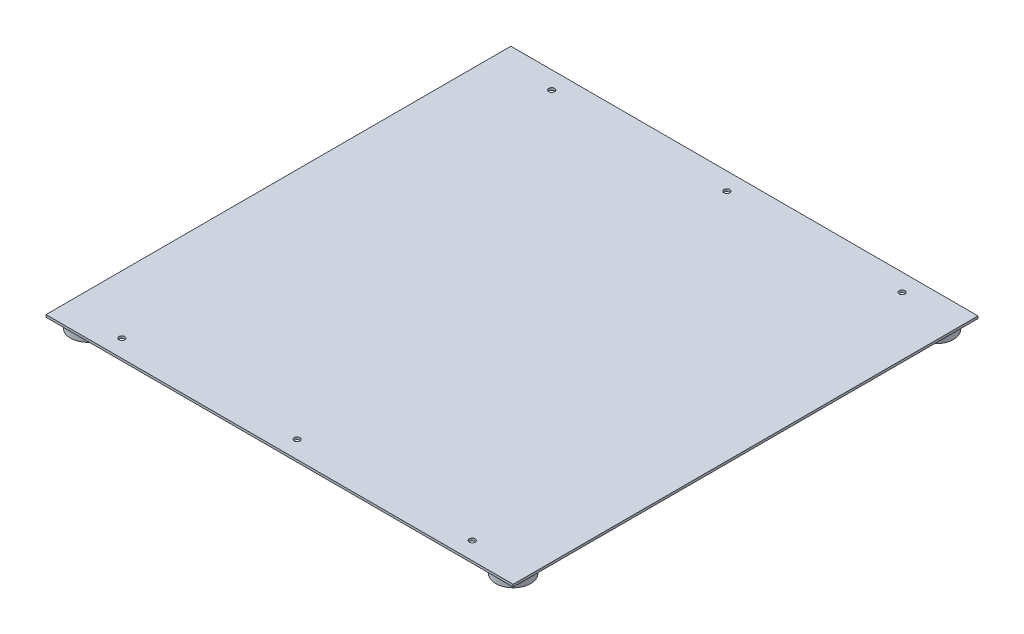
ISO-10303-21;
HEADER;
FILE_DESCRIPTION(('STEP AP214'),'2;1');
FILE_NAME('part.step','',(''),(''),'','','');
FILE_SCHEMA(('AUTOMOTIVE_DESIGN { 1 0 10303 214 1 1 1 1 }'));
ENDSEC;
DATA;
#1=APPLICATION_CONTEXT('core data for automotive mechanical design processes');
#2=APPLICATION_PROTOCOL_DEFINITION('international standard','automotive_design',2000,#1);
#3=PRODUCT_CONTEXT('',#1,'mechanical');
#4=PRODUCT('Part','Part','',(#3));
#5=PRODUCT_RELATED_PRODUCT_CATEGORY('part','',(#4));
#6=PRODUCT_DEFINITION_FORMATION('','',#4);
#7=PRODUCT_DEFINITION_CONTEXT('part definition',#1,'design');
#8=PRODUCT_DEFINITION('design','',#6,#7);
#9=PRODUCT_DEFINITION_SHAPE('','',#8);
#10=(LENGTH_UNIT() NAMED_UNIT(*) SI_UNIT(.MILLI.,.METRE.));
#11=(NAMED_UNIT(*) PLANE_ANGLE_UNIT() SI_UNIT($,.RADIAN.));
#12=(NAMED_UNIT(*) SI_UNIT($,.STERADIAN.) SOLID_ANGLE_UNIT());
#13=UNCERTAINTY_MEASURE_WITH_UNIT(LENGTH_MEASURE(1.E-05),#10,'distance_accuracy_value','');
#14=(GEOMETRIC_REPRESENTATION_CONTEXT(3) GLOBAL_UNCERTAINTY_ASSIGNED_CONTEXT((#13)) GLOBAL_UNIT_ASSIGNED_CONTEXT((#10,
#11,#12)) REPRESENTATION_CONTEXT('',''));
#15=CARTESIAN_POINT('',(0.,0.,0.));
#16=DIRECTION('',(0.,0.,1.));
#17=DIRECTION('',(1.,0.,0.));
#18=AXIS2_PLACEMENT_3D('',#15,#16,#17);
#19=CARTESIAN_POINT('',(0.,2.,0.));
#20=DIRECTION('',(0.,-1.,0.));
#21=DIRECTION('',(0.,0.,-1.));
#22=AXIS2_PLACEMENT_3D('',#19,#20,#21);
#23=PLANE('',#22);
#24=DIRECTION('',(0.,0.,1.));
#25=VECTOR('',#24,1.);
#26=CARTESIAN_POINT('',(0.,2.,0.));
#27=LINE('',#26,#25);
#28=CARTESIAN_POINT('',(0.,2.,-398.));
#29=VERTEX_POINT('',#28);
#30=CARTESIAN_POINT('',(0.,2.,0.));
#31=VERTEX_POINT('',#30);
#32=EDGE_CURVE('E88',#29,#31,#27,.T.);
#33=ORIENTED_EDGE('',*,*,#32,.T.);
#34=DIRECTION('',(1.,0.,0.));
#35=VECTOR('',#34,1.);
#36=CARTESIAN_POINT('',(0.,2.,0.));
#37=LINE('',#36,#35);
#38=CARTESIAN_POINT('',(400.,2.,0.));
#39=VERTEX_POINT('',#38);
#40=EDGE_CURVE('E83',#31,#39,#37,.T.);
#41=ORIENTED_EDGE('',*,*,#40,.T.);
#42=DIRECTION('',(0.,0.,-1.));
#43=VECTOR('',#42,1.);
#44=CARTESIAN_POINT('',(400.,2.,0.));
#45=LINE('',#44,#43);
#46=CARTESIAN_POINT('',(400.,2.,-398.));
#47=VERTEX_POINT('',#46);
#48=EDGE_CURVE('E86',#39,#47,#45,.T.);
#49=ORIENTED_EDGE('',*,*,#48,.T.);
#50=DIRECTION('',(-1.,0.,0.));
#51=VECTOR('',#50,1.);
#52=CARTESIAN_POINT('',(0.,2.,-398.));
#53=LINE('',#52,#51);
#54=EDGE_CURVE('E53',#47,#29,#53,.T.);
#55=ORIENTED_EDGE('',*,*,#54,.T.);
#56=EDGE_LOOP('',(#33,#41,#49,#55));
#57=FACE_BOUND('',#56,.T.);
#58=CARTESIAN_POINT('',(50.,2.,-15.));
#59=DIRECTION('',(0.,1.,0.));
#60=DIRECTION('',(0.,0.,1.));
#61=AXIS2_PLACEMENT_3D('',#58,#59,#60);
#62=CIRCLE('',#61,2.5);
#63=CARTESIAN_POINT('',(50.,2.,-12.5));
#64=VERTEX_POINT('',#63);
#65=EDGE_CURVE('E103',#64,#64,#62,.T.);
#66=ORIENTED_EDGE('',*,*,#65,.F.);
#67=EDGE_LOOP('',(#66));
#68=FACE_BOUND('',#67,.T.);
#69=CARTESIAN_POINT('',(200.,2.,-15.));
#70=DIRECTION('',(0.,1.,0.));
#71=DIRECTION('',(0.,0.,1.));
#72=AXIS2_PLACEMENT_3D('',#69,#70,#71);
#73=CIRCLE('',#72,2.5);
#74=CARTESIAN_POINT('',(200.,2.,-12.5));
#75=VERTEX_POINT('',#74);
#76=EDGE_CURVE('E118',#75,#75,#73,.T.);
#77=ORIENTED_EDGE('',*,*,#76,.F.);
#78=EDGE_LOOP('',(#77));
#79=FACE_BOUND('',#78,.T.);
#80=CARTESIAN_POINT('',(350.,2.,-15.));
#81=DIRECTION('',(0.,1.,0.));
#82=DIRECTION('',(0.,0.,1.));
#83=AXIS2_PLACEMENT_3D('',#80,#81,#82);
#84=CIRCLE('',#83,2.50000000000002);
#85=CARTESIAN_POINT('',(350.,2.,-12.5));
#86=VERTEX_POINT('',#85);
#87=EDGE_CURVE('E124',#86,#86,#84,.T.);
#88=ORIENTED_EDGE('',*,*,#87,.F.);
#89=EDGE_LOOP('',(#88));
#90=FACE_BOUND('',#89,.T.);
#91=CARTESIAN_POINT('',(350.,2.,-383.));
#92=DIRECTION('',(0.,1.,0.));
#93=DIRECTION('',(0.,0.,-1.));
#94=AXIS2_PLACEMENT_3D('',#91,#92,#93);
#95=CIRCLE('',#94,2.50000000000002);
#96=CARTESIAN_POINT('',(350.,2.,-385.5));
#97=VERTEX_POINT('',#96);
#98=EDGE_CURVE('E130',#97,#97,#95,.T.);
#99=ORIENTED_EDGE('',*,*,#98,.F.);
#100=EDGE_LOOP('',(#99));
#101=FACE_BOUND('',#100,.T.);
#102=CARTESIAN_POINT('',(200.,2.,-383.));
#103=DIRECTION('',(0.,1.,0.));
#104=DIRECTION('',(0.,0.,-1.));
#105=AXIS2_PLACEMENT_3D('',#102,#103,#104);
#106=CIRCLE('',#105,2.5);
#107=CARTESIAN_POINT('',(200.,2.,-385.5));
#108=VERTEX_POINT('',#107);
#109=EDGE_CURVE('E136',#108,#108,#106,.T.);
#110=ORIENTED_EDGE('',*,*,#109,.F.);
#111=EDGE_LOOP('',(#110));
#112=FACE_BOUND('',#111,.T.);
#113=CARTESIAN_POINT('',(50.,2.,-383.));
#114=DIRECTION('',(0.,1.,0.));
#115=DIRECTION('',(0.,0.,-1.));
#116=AXIS2_PLACEMENT_3D('',#113,#114,#115);
#117=CIRCLE('',#116,2.5);
#118=CARTESIAN_POINT('',(50.,2.,-385.5));
#119=VERTEX_POINT('',#118);
#120=EDGE_CURVE('E142',#119,#119,#117,.T.);
#121=ORIENTED_EDGE('',*,*,#120,.F.);
#122=EDGE_LOOP('',(#121));
#123=FACE_BOUND('',#122,.T.);
#124=ADVANCED_FACE('F36',(#57,#68,#79,#90,#101,#112,#123),#23,.F.);
#125=CARTESIAN_POINT('',(0.,0.,0.));
#126=DIRECTION('',(0.,-1.,0.));
#127=DIRECTION('',(0.,0.,-1.));
#128=AXIS2_PLACEMENT_3D('',#125,#126,#127);
#129=PLANE('',#128);
#130=CARTESIAN_POINT('',(18.,0.,-380.));
#131=DIRECTION('',(0.,-1.,0.));
#132=DIRECTION('',(0.,0.,1.));
#133=AXIS2_PLACEMENT_3D('',#130,#131,#132);
#134=CIRCLE('',#133,15.);
#135=CARTESIAN_POINT('',(18.,0.,-365.));
#136=VERTEX_POINT('',#135);
#137=EDGE_CURVE('E169',#136,#136,#134,.T.);
#138=ORIENTED_EDGE('',*,*,#137,.F.);
#139=EDGE_LOOP('',(#138));
#140=FACE_BOUND('',#139,.T.);
#141=CARTESIAN_POINT('',(382.,0.,-380.));
#142=DIRECTION('',(0.,-1.,0.));
#143=DIRECTION('',(0.,0.,-1.));
#144=AXIS2_PLACEMENT_3D('',#141,#142,#143);
#145=CIRCLE('',#144,15.);
#146=CARTESIAN_POINT('',(382.,0.,-395.));
#147=VERTEX_POINT('',#146);
#148=EDGE_CURVE('E163',#147,#147,#145,.T.);
#149=ORIENTED_EDGE('',*,*,#148,.F.);
#150=EDGE_LOOP('',(#149));
#151=FACE_BOUND('',#150,.T.);
#152=CARTESIAN_POINT('',(382.,0.,-18.));
#153=DIRECTION('',(0.,-1.,0.));
#154=DIRECTION('',(0.,0.,1.));
#155=AXIS2_PLACEMENT_3D('',#152,#153,#154);
#156=CIRCLE('',#155,15.);
#157=CARTESIAN_POINT('',(382.,0.,-2.99999999999995));
#158=VERTEX_POINT('',#157);
#159=EDGE_CURVE('E157',#158,#158,#156,.T.);
#160=ORIENTED_EDGE('',*,*,#159,.F.);
#161=EDGE_LOOP('',(#160));
#162=FACE_BOUND('',#161,.T.);
#163=CARTESIAN_POINT('',(18.,0.,-18.));
#164=DIRECTION('',(0.,-1.,0.));
#165=DIRECTION('',(0.,0.,-1.));
#166=AXIS2_PLACEMENT_3D('',#163,#164,#165);
#167=CIRCLE('',#166,15.);
#168=CARTESIAN_POINT('',(18.,0.,-33.));
#169=VERTEX_POINT('',#168);
#170=EDGE_CURVE('E151',#169,#169,#167,.T.);
#171=ORIENTED_EDGE('',*,*,#170,.F.);
#172=EDGE_LOOP('',(#171));
#173=FACE_BOUND('',#172,.T.);
#174=CARTESIAN_POINT('',(200.,0.,-383.));
#175=DIRECTION('',(0.,1.,0.));
#176=DIRECTION('',(0.,0.,-1.));
#177=AXIS2_PLACEMENT_3D('',#174,#175,#176);
#178=CIRCLE('',#177,2.5);
#179=CARTESIAN_POINT('',(200.,0.,-385.5));
#180=VERTEX_POINT('',#179);
#181=EDGE_CURVE('E139',#180,#180,#178,.T.);
#182=ORIENTED_EDGE('',*,*,#181,.T.);
#183=EDGE_LOOP('',(#182));
#184=FACE_BOUND('',#183,.T.);
#185=CARTESIAN_POINT('',(350.,0.,-15.));
#186=DIRECTION('',(0.,1.,0.));
#187=DIRECTION('',(0.,0.,1.));
#188=AXIS2_PLACEMENT_3D('',#185,#186,#187);
#189=CIRCLE('',#188,2.50000000000002);
#190=CARTESIAN_POINT('',(350.,0.,-12.5));
#191=VERTEX_POINT('',#190);
#192=EDGE_CURVE('E127',#191,#191,#189,.T.);
#193=ORIENTED_EDGE('',*,*,#192,.T.);
#194=EDGE_LOOP('',(#193));
#195=FACE_BOUND('',#194,.T.);
#196=CARTESIAN_POINT('',(50.,0.,-15.));
#197=DIRECTION('',(0.,1.,0.));
#198=DIRECTION('',(0.,0.,1.));
#199=AXIS2_PLACEMENT_3D('',#196,#197,#198);
#200=CIRCLE('',#199,2.5);
#201=CARTESIAN_POINT('',(50.,0.,-12.5));
#202=VERTEX_POINT('',#201);
#203=EDGE_CURVE('E115',#202,#202,#200,.T.);
#204=ORIENTED_EDGE('',*,*,#203,.T.);
#205=EDGE_LOOP('',(#204));
#206=FACE_BOUND('',#205,.T.);
#207=DIRECTION('',(0.,0.,1.));
#208=VECTOR('',#207,1.);
#209=CARTESIAN_POINT('',(0.,0.,0.));
#210=LINE('',#209,#208);
#211=CARTESIAN_POINT('',(0.,0.,-398.));
#212=VERTEX_POINT('',#211);
#213=CARTESIAN_POINT('',(0.,0.,0.));
#214=VERTEX_POINT('',#213);
#215=EDGE_CURVE('E100',#212,#214,#210,.T.);
#216=ORIENTED_EDGE('',*,*,#215,.F.);
#217=DIRECTION('',(-1.,0.,0.));
#218=VECTOR('',#217,1.);
#219=CARTESIAN_POINT('',(0.,0.,-398.));
#220=LINE('',#219,#218);
#221=CARTESIAN_POINT('',(400.,0.,-398.));
#222=VERTEX_POINT('',#221);
#223=EDGE_CURVE('E76',#222,#212,#220,.T.);
#224=ORIENTED_EDGE('',*,*,#223,.F.);
#225=DIRECTION('',(0.,0.,-1.));
#226=VECTOR('',#225,1.);
#227=CARTESIAN_POINT('',(400.,0.,0.));
#228=LINE('',#227,#226);
#229=CARTESIAN_POINT('',(400.,0.,0.));
#230=VERTEX_POINT('',#229);
#231=EDGE_CURVE('E70',#230,#222,#228,.T.);
#232=ORIENTED_EDGE('',*,*,#231,.F.);
#233=DIRECTION('',(1.,0.,0.));
#234=VECTOR('',#233,1.);
#235=CARTESIAN_POINT('',(0.,0.,0.));
#236=LINE('',#235,#234);
#237=EDGE_CURVE('E92',#214,#230,#236,.T.);
#238=ORIENTED_EDGE('',*,*,#237,.F.);
#239=EDGE_LOOP('',(#216,#224,#232,#238));
#240=FACE_BOUND('',#239,.T.);
#241=CARTESIAN_POINT('',(200.,0.,-15.));
#242=DIRECTION('',(0.,1.,0.));
#243=DIRECTION('',(0.,0.,1.));
#244=AXIS2_PLACEMENT_3D('',#241,#242,#243);
#245=CIRCLE('',#244,2.5);
#246=CARTESIAN_POINT('',(200.,0.,-12.5));
#247=VERTEX_POINT('',#246);
#248=EDGE_CURVE('E121',#247,#247,#245,.T.);
#249=ORIENTED_EDGE('',*,*,#248,.T.);
#250=EDGE_LOOP('',(#249));
#251=FACE_BOUND('',#250,.T.);
#252=CARTESIAN_POINT('',(350.,0.,-383.));
#253=DIRECTION('',(0.,1.,0.));
#254=DIRECTION('',(0.,0.,-1.));
#255=AXIS2_PLACEMENT_3D('',#252,#253,#254);
#256=CIRCLE('',#255,2.50000000000002);
#257=CARTESIAN_POINT('',(350.,0.,-385.5));
#258=VERTEX_POINT('',#257);
#259=EDGE_CURVE('E133',#258,#258,#256,.T.);
#260=ORIENTED_EDGE('',*,*,#259,.T.);
#261=EDGE_LOOP('',(#260));
#262=FACE_BOUND('',#261,.T.);
#263=CARTESIAN_POINT('',(50.,0.,-383.));
#264=DIRECTION('',(0.,1.,0.));
#265=DIRECTION('',(0.,0.,-1.));
#266=AXIS2_PLACEMENT_3D('',#263,#264,#265);
#267=CIRCLE('',#266,2.5);
#268=CARTESIAN_POINT('',(50.,0.,-385.5));
#269=VERTEX_POINT('',#268);
#270=EDGE_CURVE('E145',#269,#269,#267,.T.);
#271=ORIENTED_EDGE('',*,*,#270,.T.);
#272=EDGE_LOOP('',(#271));
#273=FACE_BOUND('',#272,.T.);
#274=ADVANCED_FACE('F111',(#140,#151,#162,#173,#184,#195,#206,#240,#251,#262,#273),#129,.T.);
#275=CARTESIAN_POINT('',(0.,2.,0.));
#276=DIRECTION('',(1.,0.,0.));
#277=DIRECTION('',(0.,0.,-1.));
#278=AXIS2_PLACEMENT_3D('',#275,#276,#277);
#279=PLANE('',#278);
#280=ORIENTED_EDGE('',*,*,#215,.T.);
#281=DIRECTION('',(0.,-1.,0.));
#282=VECTOR('',#281,1.);
#283=CARTESIAN_POINT('',(0.,2.,0.));
#284=LINE('',#283,#282);
#285=EDGE_CURVE('E11',#31,#214,#284,.T.);
#286=ORIENTED_EDGE('',*,*,#285,.F.);
#287=ORIENTED_EDGE('',*,*,#32,.F.);
#288=DIRECTION('',(0.,-1.,0.));
#289=VECTOR('',#288,1.);
#290=CARTESIAN_POINT('',(0.,2.,-398.));
#291=LINE('',#290,#289);
#292=EDGE_CURVE('E96',#29,#212,#291,.T.);
#293=ORIENTED_EDGE('',*,*,#292,.T.);
#294=EDGE_LOOP('',(#280,#286,#287,#293));
#295=FACE_BOUND('',#294,.T.);
#296=ADVANCED_FACE('F38',(#295),#279,.F.);
#297=CARTESIAN_POINT('',(0.,2.,0.));
#298=DIRECTION('',(0.,0.,-1.));
#299=DIRECTION('',(-1.,0.,0.));
#300=AXIS2_PLACEMENT_3D('',#297,#298,#299);
#301=PLANE('',#300);
#302=ORIENTED_EDGE('',*,*,#237,.T.);
#303=DIRECTION('',(0.,-1.,0.));
#304=VECTOR('',#303,1.);
#305=CARTESIAN_POINT('',(400.,2.,0.));
#306=LINE('',#305,#304);
#307=EDGE_CURVE('E45',#39,#230,#306,.T.);
#308=ORIENTED_EDGE('',*,*,#307,.F.);
#309=ORIENTED_EDGE('',*,*,#40,.F.);
#310=ORIENTED_EDGE('',*,*,#285,.T.);
#311=EDGE_LOOP('',(#302,#308,#309,#310));
#312=FACE_BOUND('',#311,.T.);
#313=ADVANCED_FACE('F91',(#312),#301,.F.);
#314=CARTESIAN_POINT('',(400.,2.,0.));
#315=DIRECTION('',(-1.,0.,0.));
#316=DIRECTION('',(0.,0.,1.));
#317=AXIS2_PLACEMENT_3D('',#314,#315,#316);
#318=PLANE('',#317);
#319=ORIENTED_EDGE('',*,*,#231,.T.);
#320=DIRECTION('',(0.,-1.,0.));
#321=VECTOR('',#320,1.);
#322=CARTESIAN_POINT('',(400.,2.,-398.));
#323=LINE('',#322,#321);
#324=EDGE_CURVE('E93',#47,#222,#323,.T.);
#325=ORIENTED_EDGE('',*,*,#324,.F.);
#326=ORIENTED_EDGE('',*,*,#48,.F.);
#327=ORIENTED_EDGE('',*,*,#307,.T.);
#328=EDGE_LOOP('',(#319,#325,#326,#327));
#329=FACE_BOUND('',#328,.T.);
#330=ADVANCED_FACE('F94',(#329),#318,.F.);
#331=CARTESIAN_POINT('',(0.,2.,-398.));
#332=DIRECTION('',(0.,0.,1.));
#333=DIRECTION('',(1.,0.,0.));
#334=AXIS2_PLACEMENT_3D('',#331,#332,#333);
#335=PLANE('',#334);
#336=ORIENTED_EDGE('',*,*,#223,.T.);
#337=ORIENTED_EDGE('',*,*,#292,.F.);
#338=ORIENTED_EDGE('',*,*,#54,.F.);
#339=ORIENTED_EDGE('',*,*,#324,.T.);
#340=EDGE_LOOP('',(#336,#337,#338,#339));
#341=FACE_BOUND('',#340,.T.);
#342=ADVANCED_FACE('F108',(#341),#335,.F.);
#343=CARTESIAN_POINT('',(50.,2.,-15.));
#344=DIRECTION('',(0.,-1.,0.));
#345=DIRECTION('',(0.,0.,-1.));
#346=AXIS2_PLACEMENT_3D('',#343,#344,#345);
#347=CYLINDRICAL_SURFACE('',#346,2.5);
#348=ORIENTED_EDGE('',*,*,#65,.T.);
#349=EDGE_LOOP('',(#348));
#350=FACE_BOUND('',#349,.T.);
#351=ORIENTED_EDGE('',*,*,#203,.F.);
#352=EDGE_LOOP('',(#351));
#353=FACE_BOUND('',#352,.T.);
#354=ADVANCED_FACE('F199',(#350,#353),#347,.F.);
#355=CARTESIAN_POINT('',(200.,2.,-15.));
#356=DIRECTION('',(0.,-1.,0.));
#357=DIRECTION('',(0.,0.,-1.));
#358=AXIS2_PLACEMENT_3D('',#355,#356,#357);
#359=CYLINDRICAL_SURFACE('',#358,2.5);
#360=ORIENTED_EDGE('',*,*,#76,.T.);
#361=EDGE_LOOP('',(#360));
#362=FACE_BOUND('',#361,.T.);
#363=ORIENTED_EDGE('',*,*,#248,.F.);
#364=EDGE_LOOP('',(#363));
#365=FACE_BOUND('',#364,.T.);
#366=ADVANCED_FACE('F201',(#362,#365),#359,.F.);
#367=CARTESIAN_POINT('',(350.,2.,-15.));
#368=DIRECTION('',(0.,-1.,0.));
#369=DIRECTION('',(0.,0.,-1.));
#370=AXIS2_PLACEMENT_3D('',#367,#368,#369);
#371=CYLINDRICAL_SURFACE('',#370,2.50000000000002);
#372=ORIENTED_EDGE('',*,*,#87,.T.);
#373=EDGE_LOOP('',(#372));
#374=FACE_BOUND('',#373,.T.);
#375=ORIENTED_EDGE('',*,*,#192,.F.);
#376=EDGE_LOOP('',(#375));
#377=FACE_BOUND('',#376,.T.);
#378=ADVANCED_FACE('F208',(#374,#377),#371,.F.);
#379=CARTESIAN_POINT('',(350.,2.,-383.));
#380=DIRECTION('',(0.,-1.,0.));
#381=DIRECTION('',(0.,0.,-1.));
#382=AXIS2_PLACEMENT_3D('',#379,#380,#381);
#383=CYLINDRICAL_SURFACE('',#382,2.50000000000002);
#384=ORIENTED_EDGE('',*,*,#98,.T.);
#385=EDGE_LOOP('',(#384));
#386=FACE_BOUND('',#385,.T.);
#387=ORIENTED_EDGE('',*,*,#259,.F.);
#388=EDGE_LOOP('',(#387));
#389=FACE_BOUND('',#388,.T.);
#390=ADVANCED_FACE('F319',(#386,#389),#383,.F.);
#391=CARTESIAN_POINT('',(200.,2.,-383.));
#392=DIRECTION('',(0.,-1.,0.));
#393=DIRECTION('',(0.,0.,-1.));
#394=AXIS2_PLACEMENT_3D('',#391,#392,#393);
#395=CYLINDRICAL_SURFACE('',#394,2.5);
#396=ORIENTED_EDGE('',*,*,#109,.T.);
#397=EDGE_LOOP('',(#396));
#398=FACE_BOUND('',#397,.T.);
#399=ORIENTED_EDGE('',*,*,#181,.F.);
#400=EDGE_LOOP('',(#399));
#401=FACE_BOUND('',#400,.T.);
#402=ADVANCED_FACE('F315',(#398,#401),#395,.F.);
#403=CARTESIAN_POINT('',(50.,2.,-383.));
#404=DIRECTION('',(0.,-1.,0.));
#405=DIRECTION('',(0.,0.,-1.));
#406=AXIS2_PLACEMENT_3D('',#403,#404,#405);
#407=CYLINDRICAL_SURFACE('',#406,2.5);
#408=ORIENTED_EDGE('',*,*,#120,.T.);
#409=EDGE_LOOP('',(#408));
#410=FACE_BOUND('',#409,.T.);
#411=ORIENTED_EDGE('',*,*,#270,.F.);
#412=EDGE_LOOP('',(#411));
#413=FACE_BOUND('',#412,.T.);
#414=ADVANCED_FACE('F236',(#410,#413),#407,.F.);
#415=CARTESIAN_POINT('',(18.,-8.,-18.));
#416=DIRECTION('',(0.,1.,0.));
#417=DIRECTION('',(0.,0.,1.));
#418=AXIS2_PLACEMENT_3D('',#415,#416,#417);
#419=CYLINDRICAL_SURFACE('',#418,15.);
#420=CARTESIAN_POINT('',(18.,-8.,-18.));
#421=DIRECTION('',(0.,-1.,0.));
#422=DIRECTION('',(0.,0.,-1.));
#423=AXIS2_PLACEMENT_3D('',#420,#421,#422);
#424=CIRCLE('',#423,15.);
#425=CARTESIAN_POINT('',(18.,-8.,-33.));
#426=VERTEX_POINT('',#425);
#427=EDGE_CURVE('E148',#426,#426,#424,.T.);
#428=ORIENTED_EDGE('',*,*,#427,.F.);
#429=EDGE_LOOP('',(#428));
#430=FACE_BOUND('',#429,.T.);
#431=ORIENTED_EDGE('',*,*,#170,.T.);
#432=EDGE_LOOP('',(#431));
#433=FACE_BOUND('',#432,.T.);
#434=ADVANCED_FACE('F241',(#430,#433),#419,.T.);
#435=CARTESIAN_POINT('',(18.,-8.,-18.));
#436=DIRECTION('',(0.,-1.,0.));
#437=DIRECTION('',(0.,0.,-1.));
#438=AXIS2_PLACEMENT_3D('',#435,#436,#437);
#439=PLANE('',#438);
#440=ORIENTED_EDGE('',*,*,#427,.T.);
#441=EDGE_LOOP('',(#440));
#442=FACE_BOUND('',#441,.T.);
#443=ADVANCED_FACE('F246',(#442),#439,.T.);
#444=CARTESIAN_POINT('',(382.,-8.,-18.));
#445=DIRECTION('',(0.,1.,0.));
#446=DIRECTION('',(0.,0.,1.));
#447=AXIS2_PLACEMENT_3D('',#444,#445,#446);
#448=CYLINDRICAL_SURFACE('',#447,15.);
#449=CARTESIAN_POINT('',(382.,-8.,-18.));
#450=DIRECTION('',(0.,-1.,0.));
#451=DIRECTION('',(0.,0.,1.));
#452=AXIS2_PLACEMENT_3D('',#449,#450,#451);
#453=CIRCLE('',#452,15.);
#454=CARTESIAN_POINT('',(382.,-8.,-2.99999999999995));
#455=VERTEX_POINT('',#454);
#456=EDGE_CURVE('E154',#455,#455,#453,.T.);
#457=ORIENTED_EDGE('',*,*,#456,.F.);
#458=EDGE_LOOP('',(#457));
#459=FACE_BOUND('',#458,.T.);
#460=ORIENTED_EDGE('',*,*,#159,.T.);
#461=EDGE_LOOP('',(#460));
#462=FACE_BOUND('',#461,.T.);
#463=ADVANCED_FACE('F256',(#459,#462),#448,.T.);
#464=CARTESIAN_POINT('',(382.,-8.,-18.));
#465=DIRECTION('',(0.,1.,0.));
#466=DIRECTION('',(0.,0.,1.));
#467=AXIS2_PLACEMENT_3D('',#464,#465,#466);
#468=PLANE('',#467);
#469=ORIENTED_EDGE('',*,*,#456,.T.);
#470=EDGE_LOOP('',(#469));
#471=FACE_BOUND('',#470,.T.);
#472=ADVANCED_FACE('F266',(#471),#468,.F.);
#473=CARTESIAN_POINT('',(382.,-8.,-380.));
#474=DIRECTION('',(0.,1.,0.));
#475=DIRECTION('',(0.,0.,1.));
#476=AXIS2_PLACEMENT_3D('',#473,#474,#475);
#477=CYLINDRICAL_SURFACE('',#476,15.);
#478=CARTESIAN_POINT('',(382.,-8.,-380.));
#479=DIRECTION('',(0.,-1.,0.));
#480=DIRECTION('',(0.,0.,-1.));
#481=AXIS2_PLACEMENT_3D('',#478,#479,#480);
#482=CIRCLE('',#481,15.);
#483=CARTESIAN_POINT('',(382.,-8.,-395.));
#484=VERTEX_POINT('',#483);
#485=EDGE_CURVE('E160',#484,#484,#482,.T.);
#486=ORIENTED_EDGE('',*,*,#485,.F.);
#487=EDGE_LOOP('',(#486));
#488=FACE_BOUND('',#487,.T.);
#489=ORIENTED_EDGE('',*,*,#148,.T.);
#490=EDGE_LOOP('',(#489));
#491=FACE_BOUND('',#490,.T.);
#492=ADVANCED_FACE('F276',(#488,#491),#477,.T.);
#493=CARTESIAN_POINT('',(382.,-8.,-380.));
#494=DIRECTION('',(0.,-1.,0.));
#495=DIRECTION('',(0.,0.,-1.));
#496=AXIS2_PLACEMENT_3D('',#493,#494,#495);
#497=PLANE('',#496);
#498=ORIENTED_EDGE('',*,*,#485,.T.);
#499=EDGE_LOOP('',(#498));
#500=FACE_BOUND('',#499,.T.);
#501=ADVANCED_FACE('F180',(#500),#497,.T.);
#502=CARTESIAN_POINT('',(18.,-8.,-380.));
#503=DIRECTION('',(0.,1.,0.));
#504=DIRECTION('',(0.,0.,1.));
#505=AXIS2_PLACEMENT_3D('',#502,#503,#504);
#506=CYLINDRICAL_SURFACE('',#505,15.);
#507=CARTESIAN_POINT('',(18.,-8.,-380.));
#508=DIRECTION('',(0.,-1.,0.));
#509=DIRECTION('',(0.,0.,1.));
#510=AXIS2_PLACEMENT_3D('',#507,#508,#509);
#511=CIRCLE('',#510,15.);
#512=CARTESIAN_POINT('',(18.,-8.,-365.));
#513=VERTEX_POINT('',#512);
#514=EDGE_CURVE('E166',#513,#513,#511,.T.);
#515=ORIENTED_EDGE('',*,*,#514,.F.);
#516=EDGE_LOOP('',(#515));
#517=FACE_BOUND('',#516,.T.);
#518=ORIENTED_EDGE('',*,*,#137,.T.);
#519=EDGE_LOOP('',(#518));
#520=FACE_BOUND('',#519,.T.);
#521=ADVANCED_FACE('F177',(#517,#520),#506,.T.);
#522=CARTESIAN_POINT('',(18.,-8.,-380.));
#523=DIRECTION('',(0.,1.,0.));
#524=DIRECTION('',(0.,0.,1.));
#525=AXIS2_PLACEMENT_3D('',#522,#523,#524);
#526=PLANE('',#525);
#527=ORIENTED_EDGE('',*,*,#514,.T.);
#528=EDGE_LOOP('',(#527));
#529=FACE_BOUND('',#528,.T.);
#530=ADVANCED_FACE('F175',(#529),#526,.F.);
#531=CLOSED_SHELL('',(#124,#274,#296,#313,#330,#342,#354,#366,#378,#390,#402,#414,#434,#443,
#463,#472,#492,#501,#521,#530));
#532=MANIFOLD_SOLID_BREP('B2',#531);
#533=ADVANCED_BREP_SHAPE_REPRESENTATION('',(#18,#532),#14);
#534=SHAPE_DEFINITION_REPRESENTATION(#9,#533);
ENDSEC;
END-ISO-10303-21;
